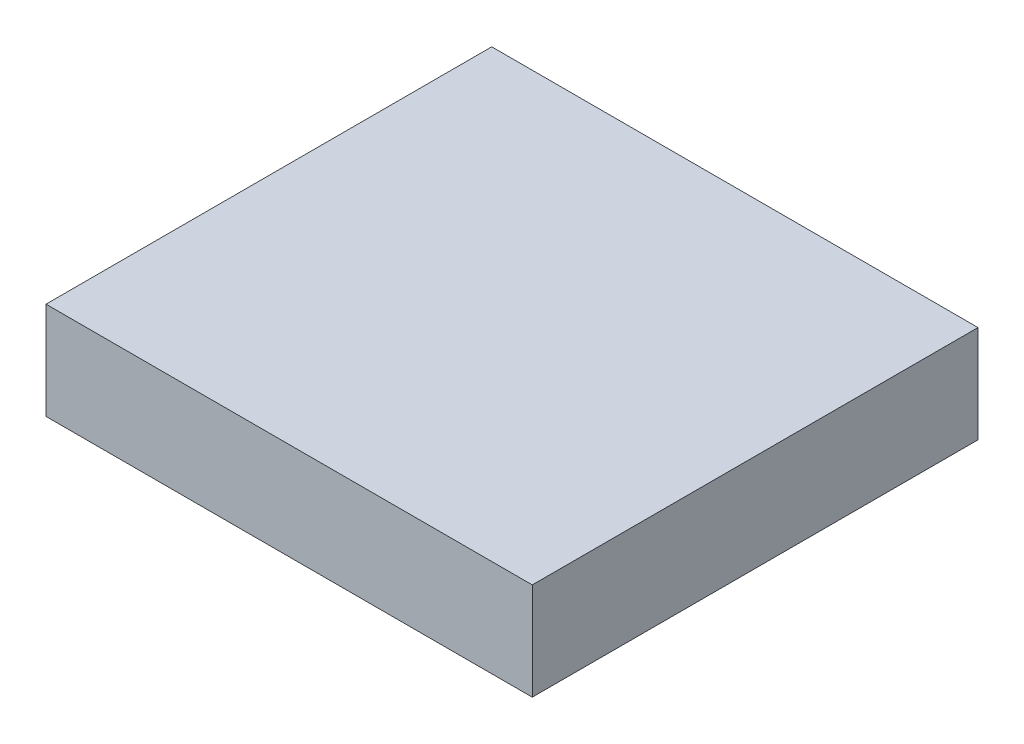
ISO-10303-21;
HEADER;
FILE_DESCRIPTION(('STEP AP214'),'2;1');
FILE_NAME('part.step','',(''),(''),'','','');
FILE_SCHEMA(('AUTOMOTIVE_DESIGN { 1 0 10303 214 1 1 1 1 }'));
ENDSEC;
DATA;
#1=APPLICATION_CONTEXT('core data for automotive mechanical design processes');
#2=APPLICATION_PROTOCOL_DEFINITION('international standard','automotive_design',2000,#1);
#3=PRODUCT_CONTEXT('',#1,'mechanical');
#4=PRODUCT('Part','Part','',(#3));
#5=PRODUCT_RELATED_PRODUCT_CATEGORY('part','',(#4));
#6=PRODUCT_DEFINITION_FORMATION('','',#4);
#7=PRODUCT_DEFINITION_CONTEXT('part definition',#1,'design');
#8=PRODUCT_DEFINITION('design','',#6,#7);
#9=PRODUCT_DEFINITION_SHAPE('','',#8);
#10=(LENGTH_UNIT() NAMED_UNIT(*) SI_UNIT(.MILLI.,.METRE.));
#11=(NAMED_UNIT(*) PLANE_ANGLE_UNIT() SI_UNIT($,.RADIAN.));
#12=(NAMED_UNIT(*) SI_UNIT($,.STERADIAN.) SOLID_ANGLE_UNIT());
#13=UNCERTAINTY_MEASURE_WITH_UNIT(LENGTH_MEASURE(1.E-05),#10,'distance_accuracy_value','');
#14=(GEOMETRIC_REPRESENTATION_CONTEXT(3) GLOBAL_UNCERTAINTY_ASSIGNED_CONTEXT((#13)) GLOBAL_UNIT_ASSIGNED_CONTEXT((#10,
#11,#12)) REPRESENTATION_CONTEXT('',''));
#15=CARTESIAN_POINT('',(0.,0.,0.));
#16=DIRECTION('',(0.,0.,1.));
#17=DIRECTION('',(1.,0.,0.));
#18=AXIS2_PLACEMENT_3D('',#15,#16,#17);
#19=CARTESIAN_POINT('',(0.,12.,0.));
#20=DIRECTION('',(1.,0.,0.));
#21=DIRECTION('',(0.,0.,-1.));
#22=AXIS2_PLACEMENT_3D('',#19,#20,#21);
#23=PLANE('',#22);
#24=DIRECTION('',(0.,0.,1.));
#25=VECTOR('',#24,1.);
#26=CARTESIAN_POINT('',(0.,0.,0.));
#27=LINE('',#26,#25);
#28=CARTESIAN_POINT('',(0.,0.,-55.));
#29=VERTEX_POINT('',#28);
#30=CARTESIAN_POINT('',(0.,0.,0.));
#31=VERTEX_POINT('',#30);
#32=EDGE_CURVE('E96',#29,#31,#27,.T.);
#33=ORIENTED_EDGE('',*,*,#32,.T.);
#34=DIRECTION('',(0.,-1.,0.));
#35=VECTOR('',#34,1.);
#36=CARTESIAN_POINT('',(0.,12.,0.));
#37=LINE('',#36,#35);
#38=CARTESIAN_POINT('',(0.,12.,0.));
#39=VERTEX_POINT('',#38);
#40=EDGE_CURVE('E11',#39,#31,#37,.T.);
#41=ORIENTED_EDGE('',*,*,#40,.F.);
#42=DIRECTION('',(0.,0.,1.));
#43=VECTOR('',#42,1.);
#44=CARTESIAN_POINT('',(0.,12.,0.));
#45=LINE('',#44,#43);
#46=CARTESIAN_POINT('',(0.,12.,-55.));
#47=VERTEX_POINT('',#46);
#48=EDGE_CURVE('E84',#47,#39,#45,.T.);
#49=ORIENTED_EDGE('',*,*,#48,.F.);
#50=DIRECTION('',(0.,-1.,0.));
#51=VECTOR('',#50,1.);
#52=CARTESIAN_POINT('',(0.,12.,-55.));
#53=LINE('',#52,#51);
#54=EDGE_CURVE('E92',#47,#29,#53,.T.);
#55=ORIENTED_EDGE('',*,*,#54,.T.);
#56=EDGE_LOOP('',(#33,#41,#49,#55));
#57=FACE_BOUND('',#56,.T.);
#58=ADVANCED_FACE('F33',(#57),#23,.F.);
#59=CARTESIAN_POINT('',(0.,12.,0.));
#60=DIRECTION('',(0.,0.,-1.));
#61=DIRECTION('',(-1.,0.,0.));
#62=AXIS2_PLACEMENT_3D('',#59,#60,#61);
#63=PLANE('',#62);
#64=DIRECTION('',(1.,0.,0.));
#65=VECTOR('',#64,1.);
#66=CARTESIAN_POINT('',(0.,0.,0.));
#67=LINE('',#66,#65);
#68=CARTESIAN_POINT('',(60.,0.,0.));
#69=VERTEX_POINT('',#68);
#70=EDGE_CURVE('E88',#31,#69,#67,.T.);
#71=ORIENTED_EDGE('',*,*,#70,.T.);
#72=DIRECTION('',(0.,-1.,0.));
#73=VECTOR('',#72,1.);
#74=CARTESIAN_POINT('',(60.,12.,0.));
#75=LINE('',#74,#73);
#76=CARTESIAN_POINT('',(60.,12.,0.));
#77=VERTEX_POINT('',#76);
#78=EDGE_CURVE('E41',#77,#69,#75,.T.);
#79=ORIENTED_EDGE('',*,*,#78,.F.);
#80=DIRECTION('',(1.,0.,0.));
#81=VECTOR('',#80,1.);
#82=CARTESIAN_POINT('',(0.,12.,0.));
#83=LINE('',#82,#81);
#84=EDGE_CURVE('E79',#39,#77,#83,.T.);
#85=ORIENTED_EDGE('',*,*,#84,.F.);
#86=ORIENTED_EDGE('',*,*,#40,.T.);
#87=EDGE_LOOP('',(#71,#79,#85,#86));
#88=FACE_BOUND('',#87,.T.);
#89=ADVANCED_FACE('F87',(#88),#63,.F.);
#90=CARTESIAN_POINT('',(60.,12.,0.));
#91=DIRECTION('',(-1.,0.,0.));
#92=DIRECTION('',(0.,0.,1.));
#93=AXIS2_PLACEMENT_3D('',#90,#91,#92);
#94=PLANE('',#93);
#95=DIRECTION('',(0.,0.,-1.));
#96=VECTOR('',#95,1.);
#97=CARTESIAN_POINT('',(60.,0.,0.));
#98=LINE('',#97,#96);
#99=CARTESIAN_POINT('',(60.,0.,-55.));
#100=VERTEX_POINT('',#99);
#101=EDGE_CURVE('E66',#69,#100,#98,.T.);
#102=ORIENTED_EDGE('',*,*,#101,.T.);
#103=DIRECTION('',(0.,-1.,0.));
#104=VECTOR('',#103,1.);
#105=CARTESIAN_POINT('',(60.,12.,-55.));
#106=LINE('',#105,#104);
#107=CARTESIAN_POINT('',(60.,12.,-55.));
#108=VERTEX_POINT('',#107);
#109=EDGE_CURVE('E89',#108,#100,#106,.T.);
#110=ORIENTED_EDGE('',*,*,#109,.F.);
#111=DIRECTION('',(0.,0.,-1.));
#112=VECTOR('',#111,1.);
#113=CARTESIAN_POINT('',(60.,12.,0.));
#114=LINE('',#113,#112);
#115=EDGE_CURVE('E82',#77,#108,#114,.T.);
#116=ORIENTED_EDGE('',*,*,#115,.F.);
#117=ORIENTED_EDGE('',*,*,#78,.T.);
#118=EDGE_LOOP('',(#102,#110,#116,#117));
#119=FACE_BOUND('',#118,.T.);
#120=ADVANCED_FACE('F90',(#119),#94,.F.);
#121=CARTESIAN_POINT('',(0.,12.,-55.));
#122=DIRECTION('',(0.,0.,1.));
#123=DIRECTION('',(1.,0.,0.));
#124=AXIS2_PLACEMENT_3D('',#121,#122,#123);
#125=PLANE('',#124);
#126=DIRECTION('',(-1.,0.,0.));
#127=VECTOR('',#126,1.);
#128=CARTESIAN_POINT('',(0.,0.,-55.));
#129=LINE('',#128,#127);
#130=EDGE_CURVE('E72',#100,#29,#129,.T.);
#131=ORIENTED_EDGE('',*,*,#130,.T.);
#132=ORIENTED_EDGE('',*,*,#54,.F.);
#133=DIRECTION('',(-1.,0.,0.));
#134=VECTOR('',#133,1.);
#135=CARTESIAN_POINT('',(0.,12.,-55.));
#136=LINE('',#135,#134);
#137=EDGE_CURVE('E49',#108,#47,#136,.T.);
#138=ORIENTED_EDGE('',*,*,#137,.F.);
#139=ORIENTED_EDGE('',*,*,#109,.T.);
#140=EDGE_LOOP('',(#131,#132,#138,#139));
#141=FACE_BOUND('',#140,.T.);
#142=ADVANCED_FACE('F103',(#141),#125,.F.);
#143=CARTESIAN_POINT('',(0.,12.,0.));
#144=DIRECTION('',(0.,-1.,0.));
#145=DIRECTION('',(0.,0.,-1.));
#146=AXIS2_PLACEMENT_3D('',#143,#144,#145);
#147=PLANE('',#146);
#148=ORIENTED_EDGE('',*,*,#48,.T.);
#149=ORIENTED_EDGE('',*,*,#84,.T.);
#150=ORIENTED_EDGE('',*,*,#115,.T.);
#151=ORIENTED_EDGE('',*,*,#137,.T.);
#152=EDGE_LOOP('',(#148,#149,#150,#151));
#153=FACE_BOUND('',#152,.T.);
#154=ADVANCED_FACE('F80',(#153),#147,.F.);
#155=CARTESIAN_POINT('',(0.,0.,0.));
#156=DIRECTION('',(0.,-1.,0.));
#157=DIRECTION('',(0.,0.,-1.));
#158=AXIS2_PLACEMENT_3D('',#155,#156,#157);
#159=PLANE('',#158);
#160=ORIENTED_EDGE('',*,*,#32,.F.);
#161=ORIENTED_EDGE('',*,*,#130,.F.);
#162=ORIENTED_EDGE('',*,*,#101,.F.);
#163=ORIENTED_EDGE('',*,*,#70,.F.);
#164=EDGE_LOOP('',(#160,#161,#162,#163));
#165=FACE_BOUND('',#164,.T.);
#166=ADVANCED_FACE('F106',(#165),#159,.T.);
#167=CLOSED_SHELL('',(#58,#89,#120,#142,#154,#166));
#168=MANIFOLD_SOLID_BREP('B2',#167);
#169=ADVANCED_BREP_SHAPE_REPRESENTATION('',(#18,#168),#14);
#170=SHAPE_DEFINITION_REPRESENTATION(#9,#169);
ENDSEC;
END-ISO-10303-21;
